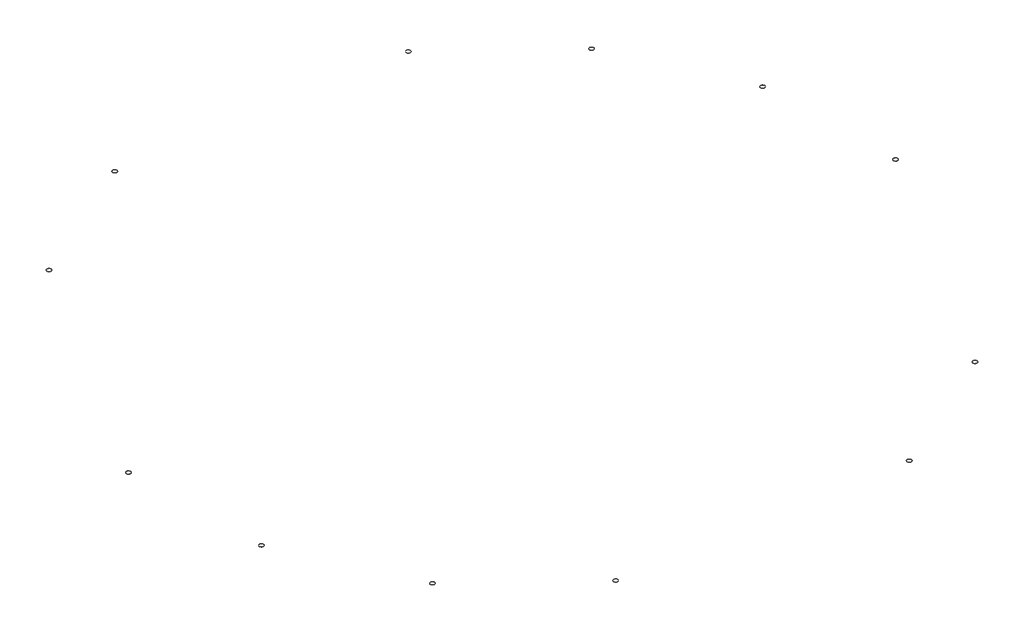
ISO-10303-21;
HEADER;
FILE_DESCRIPTION(('STEP AP214'),'2;1');
FILE_NAME('part.step','',(''),(''),'','','');
FILE_SCHEMA(('AUTOMOTIVE_DESIGN { 1 0 10303 214 1 1 1 1 }'));
ENDSEC;
DATA;
#1=APPLICATION_CONTEXT('core data for automotive mechanical design processes');
#2=APPLICATION_PROTOCOL_DEFINITION('international standard','automotive_design',2000,#1);
#3=PRODUCT_CONTEXT('',#1,'mechanical');
#4=PRODUCT('Part','Part','',(#3));
#5=PRODUCT_RELATED_PRODUCT_CATEGORY('part','',(#4));
#6=PRODUCT_DEFINITION_FORMATION('','',#4);
#7=PRODUCT_DEFINITION_CONTEXT('part definition',#1,'design');
#8=PRODUCT_DEFINITION('design','',#6,#7);
#9=PRODUCT_DEFINITION_SHAPE('','',#8);
#10=(LENGTH_UNIT() NAMED_UNIT(*) SI_UNIT(.MILLI.,.METRE.));
#11=(NAMED_UNIT(*) PLANE_ANGLE_UNIT() SI_UNIT($,.RADIAN.));
#12=(NAMED_UNIT(*) SI_UNIT($,.STERADIAN.) SOLID_ANGLE_UNIT());
#13=UNCERTAINTY_MEASURE_WITH_UNIT(LENGTH_MEASURE(1.E-05),#10,'distance_accuracy_value','');
#14=(GEOMETRIC_REPRESENTATION_CONTEXT(3) GLOBAL_UNCERTAINTY_ASSIGNED_CONTEXT((#13)) GLOBAL_UNIT_ASSIGNED_CONTEXT((#10,
#11,#12)) REPRESENTATION_CONTEXT('',''));
#15=CARTESIAN_POINT('',(0.,0.,0.));
#16=DIRECTION('',(0.,0.,1.));
#17=DIRECTION('',(1.,0.,0.));
#18=AXIS2_PLACEMENT_3D('',#15,#16,#17);
#19=CARTESIAN_POINT('',(-3286.66746070596,3.175,-2073.73273175129));
#20=DIRECTION('',(0.,1.,0.));
#21=DIRECTION('',(0.,0.,1.));
#22=AXIS2_PLACEMENT_3D('',#19,#20,#21);
#23=PLANE('',#22);
#24=CARTESIAN_POINT('',(-3286.66746070596,3.175,-2073.73273175129));
#25=DIRECTION('',(0.,1.,0.));
#26=DIRECTION('',(0.,0.,1.));
#27=AXIS2_PLACEMENT_3D('',#24,#25,#26);
#28=CIRCLE('',#27,25.3999999999998);
#29=CARTESIAN_POINT('',(-3286.66746070596,3.175,-2048.33273175129));
#30=VERTEX_POINT('',#29);
#31=EDGE_CURVE('E11',#30,#30,#28,.T.);
#32=ORIENTED_EDGE('',*,*,#31,.T.);
#33=EDGE_LOOP('',(#32));
#34=FACE_BOUND('',#33,.T.);
#35=CARTESIAN_POINT('',(-3286.66746070596,3.175,-2073.73273175129));
#36=DIRECTION('',(0.,1.,0.));
#37=DIRECTION('',(0.,0.,1.));
#38=AXIS2_PLACEMENT_3D('',#35,#36,#37);
#39=CIRCLE('',#38,22.2250000000001);
#40=CARTESIAN_POINT('',(-3286.66746070596,3.175,-2051.50773175129));
#41=VERTEX_POINT('',#40);
#42=EDGE_CURVE('E51',#41,#41,#39,.T.);
#43=ORIENTED_EDGE('',*,*,#42,.F.);
#44=EDGE_LOOP('',(#43));
#45=FACE_BOUND('',#44,.T.);
#46=ADVANCED_FACE('F40',(#34,#45),#23,.T.);
#47=CARTESIAN_POINT('',(-3286.66746070596,0.,-2073.73273175129));
#48=DIRECTION('',(0.,1.,0.));
#49=DIRECTION('',(0.,0.,1.));
#50=AXIS2_PLACEMENT_3D('',#47,#48,#49);
#51=PLANE('',#50);
#52=CARTESIAN_POINT('',(-3286.66746070596,0.,-2073.73273175129));
#53=DIRECTION('',(0.,1.,0.));
#54=DIRECTION('',(0.,0.,1.));
#55=AXIS2_PLACEMENT_3D('',#52,#53,#54);
#56=CIRCLE('',#55,25.3999999999998);
#57=CARTESIAN_POINT('',(-3286.66746070596,0.,-2048.33273175129));
#58=VERTEX_POINT('',#57);
#59=EDGE_CURVE('E44',#58,#58,#56,.T.);
#60=ORIENTED_EDGE('',*,*,#59,.F.);
#61=EDGE_LOOP('',(#60));
#62=FACE_BOUND('',#61,.T.);
#63=CARTESIAN_POINT('',(-3286.66746070596,0.,-2073.73273175129));
#64=DIRECTION('',(0.,1.,0.));
#65=DIRECTION('',(0.,0.,1.));
#66=AXIS2_PLACEMENT_3D('',#63,#64,#65);
#67=CIRCLE('',#66,22.2250000000001);
#68=CARTESIAN_POINT('',(-3286.66746070596,0.,-2051.50773175129));
#69=VERTEX_POINT('',#68);
#70=EDGE_CURVE('E53',#69,#69,#67,.T.);
#71=ORIENTED_EDGE('',*,*,#70,.T.);
#72=EDGE_LOOP('',(#71));
#73=FACE_BOUND('',#72,.T.);
#74=ADVANCED_FACE('F63',(#62,#73),#51,.F.);
#75=CARTESIAN_POINT('',(-3286.66746070596,3.175,-2073.73273175129));
#76=DIRECTION('',(0.,-1.,0.));
#77=DIRECTION('',(0.,0.,-1.));
#78=AXIS2_PLACEMENT_3D('',#75,#76,#77);
#79=CYLINDRICAL_SURFACE('',#78,25.3999999999998);
#80=ORIENTED_EDGE('',*,*,#31,.F.);
#81=EDGE_LOOP('',(#80));
#82=FACE_BOUND('',#81,.T.);
#83=ORIENTED_EDGE('',*,*,#59,.T.);
#84=EDGE_LOOP('',(#83));
#85=FACE_BOUND('',#84,.T.);
#86=ADVANCED_FACE('F42',(#82,#85),#79,.T.);
#87=CARTESIAN_POINT('',(-3286.66746070596,3.175,-2073.73273175129));
#88=DIRECTION('',(0.,-1.,0.));
#89=DIRECTION('',(0.,0.,-1.));
#90=AXIS2_PLACEMENT_3D('',#87,#88,#89);
#91=CYLINDRICAL_SURFACE('',#90,22.2250000000001);
#92=ORIENTED_EDGE('',*,*,#42,.T.);
#93=EDGE_LOOP('',(#92));
#94=FACE_BOUND('',#93,.T.);
#95=ORIENTED_EDGE('',*,*,#70,.F.);
#96=EDGE_LOOP('',(#95));
#97=FACE_BOUND('',#96,.T.);
#98=ADVANCED_FACE('F59',(#94,#97),#91,.F.);
#99=CLOSED_SHELL('',(#46,#74,#86,#98));
#100=MANIFOLD_SOLID_BREP('B2',#99);
#101=CARTESIAN_POINT('',(-2242.90163752268,3.175,-3173.63241166933));
#102=DIRECTION('',(0.,1.,0.));
#103=DIRECTION('',(0.,0.,1.));
#104=AXIS2_PLACEMENT_3D('',#101,#102,#103);
#105=PLANE('',#104);
#106=CARTESIAN_POINT('',(-2242.90163752268,3.175,-3173.63241166933));
#107=DIRECTION('',(0.,1.,0.));
#108=DIRECTION('',(0.,0.,1.));
#109=AXIS2_PLACEMENT_3D('',#106,#107,#108);
#110=CIRCLE('',#109,25.3999999999998);
#111=CARTESIAN_POINT('',(-2242.90163752268,3.175,-3148.23241166933));
#112=VERTEX_POINT('',#111);
#113=EDGE_CURVE('E39',#112,#112,#110,.T.);
#114=ORIENTED_EDGE('',*,*,#113,.T.);
#115=EDGE_LOOP('',(#114));
#116=FACE_BOUND('',#115,.T.);
#117=CARTESIAN_POINT('',(-2242.90163752268,3.175,-3173.63241166933));
#118=DIRECTION('',(0.,1.,0.));
#119=DIRECTION('',(0.,0.,1.));
#120=AXIS2_PLACEMENT_3D('',#117,#118,#119);
#121=CIRCLE('',#120,22.2250000000001);
#122=CARTESIAN_POINT('',(-2242.90163752268,3.175,-3151.40741166933));
#123=VERTEX_POINT('',#122);
#124=EDGE_CURVE('E121',#123,#123,#121,.T.);
#125=ORIENTED_EDGE('',*,*,#124,.F.);
#126=EDGE_LOOP('',(#125));
#127=FACE_BOUND('',#126,.T.);
#128=ADVANCED_FACE('F110',(#116,#127),#105,.T.);
#129=CARTESIAN_POINT('',(-2242.90163752268,0.,-3173.63241166933));
#130=DIRECTION('',(0.,1.,0.));
#131=DIRECTION('',(0.,0.,1.));
#132=AXIS2_PLACEMENT_3D('',#129,#130,#131);
#133=PLANE('',#132);
#134=CARTESIAN_POINT('',(-2242.90163752268,0.,-3173.63241166933));
#135=DIRECTION('',(0.,1.,0.));
#136=DIRECTION('',(0.,0.,1.));
#137=AXIS2_PLACEMENT_3D('',#134,#135,#136);
#138=CIRCLE('',#137,25.3999999999998);
#139=CARTESIAN_POINT('',(-2242.90163752268,0.,-3148.23241166933));
#140=VERTEX_POINT('',#139);
#141=EDGE_CURVE('E114',#140,#140,#138,.T.);
#142=ORIENTED_EDGE('',*,*,#141,.F.);
#143=EDGE_LOOP('',(#142));
#144=FACE_BOUND('',#143,.T.);
#145=CARTESIAN_POINT('',(-2242.90163752268,0.,-3173.63241166933));
#146=DIRECTION('',(0.,1.,0.));
#147=DIRECTION('',(0.,0.,1.));
#148=AXIS2_PLACEMENT_3D('',#145,#146,#147);
#149=CIRCLE('',#148,22.2250000000001);
#150=CARTESIAN_POINT('',(-2242.90163752268,0.,-3151.40741166933));
#151=VERTEX_POINT('',#150);
#152=EDGE_CURVE('E123',#151,#151,#149,.T.);
#153=ORIENTED_EDGE('',*,*,#152,.T.);
#154=EDGE_LOOP('',(#153));
#155=FACE_BOUND('',#154,.T.);
#156=ADVANCED_FACE('F133',(#144,#155),#133,.F.);
#157=CARTESIAN_POINT('',(-2242.90163752268,3.175,-3173.63241166933));
#158=DIRECTION('',(0.,-1.,0.));
#159=DIRECTION('',(0.,0.,-1.));
#160=AXIS2_PLACEMENT_3D('',#157,#158,#159);
#161=CYLINDRICAL_SURFACE('',#160,25.3999999999998);
#162=ORIENTED_EDGE('',*,*,#113,.F.);
#163=EDGE_LOOP('',(#162));
#164=FACE_BOUND('',#163,.T.);
#165=ORIENTED_EDGE('',*,*,#141,.T.);
#166=EDGE_LOOP('',(#165));
#167=FACE_BOUND('',#166,.T.);
#168=ADVANCED_FACE('F112',(#164,#167),#161,.T.);
#169=CARTESIAN_POINT('',(-2242.90163752268,3.175,-3173.63241166933));
#170=DIRECTION('',(0.,-1.,0.));
#171=DIRECTION('',(0.,0.,-1.));
#172=AXIS2_PLACEMENT_3D('',#169,#170,#171);
#173=CYLINDRICAL_SURFACE('',#172,22.2250000000001);
#174=ORIENTED_EDGE('',*,*,#124,.T.);
#175=EDGE_LOOP('',(#174));
#176=FACE_BOUND('',#175,.T.);
#177=ORIENTED_EDGE('',*,*,#152,.F.);
#178=EDGE_LOOP('',(#177));
#179=FACE_BOUND('',#178,.T.);
#180=ADVANCED_FACE('F129',(#176,#179),#173,.F.);
#181=CLOSED_SHELL('',(#128,#156,#168,#180));
#182=MANIFOLD_SOLID_BREP('B6',#181);
#183=CARTESIAN_POINT('',(-857.674371980562,3.175,-3790.37532596018));
#184=DIRECTION('',(0.,1.,0.));
#185=DIRECTION('',(0.,0.,1.));
#186=AXIS2_PLACEMENT_3D('',#183,#184,#185);
#187=PLANE('',#186);
#188=CARTESIAN_POINT('',(-857.674371980562,3.175,-3790.37532596018));
#189=DIRECTION('',(0.,1.,0.));
#190=DIRECTION('',(0.,0.,1.));
#191=AXIS2_PLACEMENT_3D('',#188,#189,#190);
#192=CIRCLE('',#191,25.4);
#193=CARTESIAN_POINT('',(-857.674371980562,3.175,-3764.97532596018));
#194=VERTEX_POINT('',#193);
#195=EDGE_CURVE('E109',#194,#194,#192,.T.);
#196=ORIENTED_EDGE('',*,*,#195,.T.);
#197=EDGE_LOOP('',(#196));
#198=FACE_BOUND('',#197,.T.);
#199=CARTESIAN_POINT('',(-857.674371980562,3.175,-3790.37532596018));
#200=DIRECTION('',(0.,1.,0.));
#201=DIRECTION('',(0.,0.,1.));
#202=AXIS2_PLACEMENT_3D('',#199,#200,#201);
#203=CIRCLE('',#202,22.225);
#204=CARTESIAN_POINT('',(-857.674371980562,3.175,-3768.15032596018));
#205=VERTEX_POINT('',#204);
#206=EDGE_CURVE('E191',#205,#205,#203,.T.);
#207=ORIENTED_EDGE('',*,*,#206,.F.);
#208=EDGE_LOOP('',(#207));
#209=FACE_BOUND('',#208,.T.);
#210=ADVANCED_FACE('F180',(#198,#209),#187,.T.);
#211=CARTESIAN_POINT('',(-857.674371980562,0.,-3790.37532596018));
#212=DIRECTION('',(0.,1.,0.));
#213=DIRECTION('',(0.,0.,1.));
#214=AXIS2_PLACEMENT_3D('',#211,#212,#213);
#215=PLANE('',#214);
#216=CARTESIAN_POINT('',(-857.674371980562,0.,-3790.37532596018));
#217=DIRECTION('',(0.,1.,0.));
#218=DIRECTION('',(0.,0.,1.));
#219=AXIS2_PLACEMENT_3D('',#216,#217,#218);
#220=CIRCLE('',#219,25.4);
#221=CARTESIAN_POINT('',(-857.674371980562,0.,-3764.97532596018));
#222=VERTEX_POINT('',#221);
#223=EDGE_CURVE('E184',#222,#222,#220,.T.);
#224=ORIENTED_EDGE('',*,*,#223,.F.);
#225=EDGE_LOOP('',(#224));
#226=FACE_BOUND('',#225,.T.);
#227=CARTESIAN_POINT('',(-857.674371980562,0.,-3790.37532596018));
#228=DIRECTION('',(0.,1.,0.));
#229=DIRECTION('',(0.,0.,1.));
#230=AXIS2_PLACEMENT_3D('',#227,#228,#229);
#231=CIRCLE('',#230,22.225);
#232=CARTESIAN_POINT('',(-857.674371980562,0.,-3768.15032596018));
#233=VERTEX_POINT('',#232);
#234=EDGE_CURVE('E193',#233,#233,#231,.T.);
#235=ORIENTED_EDGE('',*,*,#234,.T.);
#236=EDGE_LOOP('',(#235));
#237=FACE_BOUND('',#236,.T.);
#238=ADVANCED_FACE('F203',(#226,#237),#215,.F.);
#239=CARTESIAN_POINT('',(-857.674371980562,3.175,-3790.37532596018));
#240=DIRECTION('',(0.,-1.,0.));
#241=DIRECTION('',(0.,0.,-1.));
#242=AXIS2_PLACEMENT_3D('',#239,#240,#241);
#243=CYLINDRICAL_SURFACE('',#242,25.4);
#244=ORIENTED_EDGE('',*,*,#195,.F.);
#245=EDGE_LOOP('',(#244));
#246=FACE_BOUND('',#245,.T.);
#247=ORIENTED_EDGE('',*,*,#223,.T.);
#248=EDGE_LOOP('',(#247));
#249=FACE_BOUND('',#248,.T.);
#250=ADVANCED_FACE('F182',(#246,#249),#243,.T.);
#251=CARTESIAN_POINT('',(-857.674371980562,3.175,-3790.37532596018));
#252=DIRECTION('',(0.,-1.,0.));
#253=DIRECTION('',(0.,0.,-1.));
#254=AXIS2_PLACEMENT_3D('',#251,#252,#253);
#255=CYLINDRICAL_SURFACE('',#254,22.225);
#256=ORIENTED_EDGE('',*,*,#206,.T.);
#257=EDGE_LOOP('',(#256));
#258=FACE_BOUND('',#257,.T.);
#259=ORIENTED_EDGE('',*,*,#234,.F.);
#260=EDGE_LOOP('',(#259));
#261=FACE_BOUND('',#260,.T.);
#262=ADVANCED_FACE('F199',(#258,#261),#255,.F.);
#263=CLOSED_SHELL('',(#210,#238,#250,#262));
#264=MANIFOLD_SOLID_BREP('B34',#263);
#265=CARTESIAN_POINT('',(658.126041858051,3.175,-3830.06795671151));
#266=DIRECTION('',(0.,1.,0.));
#267=DIRECTION('',(0.,0.,1.));
#268=AXIS2_PLACEMENT_3D('',#265,#266,#267);
#269=PLANE('',#268);
#270=CARTESIAN_POINT('',(658.126041858051,3.175,-3830.06795671151));
#271=DIRECTION('',(0.,1.,0.));
#272=DIRECTION('',(0.,0.,1.));
#273=AXIS2_PLACEMENT_3D('',#270,#271,#272);
#274=CIRCLE('',#273,25.4);
#275=CARTESIAN_POINT('',(658.126041858051,3.175,-3804.66795671151));
#276=VERTEX_POINT('',#275);
#277=EDGE_CURVE('E179',#276,#276,#274,.T.);
#278=ORIENTED_EDGE('',*,*,#277,.T.);
#279=EDGE_LOOP('',(#278));
#280=FACE_BOUND('',#279,.T.);
#281=CARTESIAN_POINT('',(658.126041858051,3.175,-3830.06795671151));
#282=DIRECTION('',(0.,1.,0.));
#283=DIRECTION('',(0.,0.,1.));
#284=AXIS2_PLACEMENT_3D('',#281,#282,#283);
#285=CIRCLE('',#284,22.225);
#286=CARTESIAN_POINT('',(658.126041858051,3.175,-3807.84295671151));
#287=VERTEX_POINT('',#286);
#288=EDGE_CURVE('E261',#287,#287,#285,.T.);
#289=ORIENTED_EDGE('',*,*,#288,.F.);
#290=EDGE_LOOP('',(#289));
#291=FACE_BOUND('',#290,.T.);
#292=ADVANCED_FACE('F250',(#280,#291),#269,.T.);
#293=CARTESIAN_POINT('',(658.126041858051,0.,-3830.06795671151));
#294=DIRECTION('',(0.,1.,0.));
#295=DIRECTION('',(0.,0.,1.));
#296=AXIS2_PLACEMENT_3D('',#293,#294,#295);
#297=PLANE('',#296);
#298=CARTESIAN_POINT('',(658.126041858051,0.,-3830.06795671151));
#299=DIRECTION('',(0.,1.,0.));
#300=DIRECTION('',(0.,0.,1.));
#301=AXIS2_PLACEMENT_3D('',#298,#299,#300);
#302=CIRCLE('',#301,25.4);
#303=CARTESIAN_POINT('',(658.126041858051,0.,-3804.66795671151));
#304=VERTEX_POINT('',#303);
#305=EDGE_CURVE('E254',#304,#304,#302,.T.);
#306=ORIENTED_EDGE('',*,*,#305,.F.);
#307=EDGE_LOOP('',(#306));
#308=FACE_BOUND('',#307,.T.);
#309=CARTESIAN_POINT('',(658.126041858051,0.,-3830.06795671151));
#310=DIRECTION('',(0.,1.,0.));
#311=DIRECTION('',(0.,0.,1.));
#312=AXIS2_PLACEMENT_3D('',#309,#310,#311);
#313=CIRCLE('',#312,22.225);
#314=CARTESIAN_POINT('',(658.126041858051,0.,-3807.84295671151));
#315=VERTEX_POINT('',#314);
#316=EDGE_CURVE('E263',#315,#315,#313,.T.);
#317=ORIENTED_EDGE('',*,*,#316,.T.);
#318=EDGE_LOOP('',(#317));
#319=FACE_BOUND('',#318,.T.);
#320=ADVANCED_FACE('F273',(#308,#319),#297,.F.);
#321=CARTESIAN_POINT('',(658.126041858051,3.175,-3830.06795671151));
#322=DIRECTION('',(0.,-1.,0.));
#323=DIRECTION('',(0.,0.,-1.));
#324=AXIS2_PLACEMENT_3D('',#321,#322,#323);
#325=CYLINDRICAL_SURFACE('',#324,25.4);
#326=ORIENTED_EDGE('',*,*,#277,.F.);
#327=EDGE_LOOP('',(#326));
#328=FACE_BOUND('',#327,.T.);
#329=ORIENTED_EDGE('',*,*,#305,.T.);
#330=EDGE_LOOP('',(#329));
#331=FACE_BOUND('',#330,.T.);
#332=ADVANCED_FACE('F252',(#328,#331),#325,.T.);
#333=CARTESIAN_POINT('',(658.126041858051,3.175,-3830.06795671151));
#334=DIRECTION('',(0.,-1.,0.));
#335=DIRECTION('',(0.,0.,-1.));
#336=AXIS2_PLACEMENT_3D('',#333,#334,#335);
#337=CYLINDRICAL_SURFACE('',#336,22.225);
#338=ORIENTED_EDGE('',*,*,#288,.T.);
#339=EDGE_LOOP('',(#338));
#340=FACE_BOUND('',#339,.T.);
#341=ORIENTED_EDGE('',*,*,#316,.F.);
#342=EDGE_LOOP('',(#341));
#343=FACE_BOUND('',#342,.T.);
#344=ADVANCED_FACE('F269',(#340,#343),#337,.F.);
#345=CLOSED_SHELL('',(#292,#320,#332,#344));
#346=MANIFOLD_SOLID_BREP('B104',#345);
#347=CARTESIAN_POINT('',(3173.63241166929,3.175,-2242.90163752274));
#348=DIRECTION('',(0.,1.,0.));
#349=DIRECTION('',(0.,0.,1.));
#350=AXIS2_PLACEMENT_3D('',#347,#348,#349);
#351=PLANE('',#350);
#352=CARTESIAN_POINT('',(3173.63241166929,3.175,-2242.90163752274));
#353=DIRECTION('',(0.,1.,0.));
#354=DIRECTION('',(0.,0.,1.));
#355=AXIS2_PLACEMENT_3D('',#352,#353,#354);
#356=CIRCLE('',#355,25.3999999999998);
#357=CARTESIAN_POINT('',(3173.63241166929,3.175,-2217.50163752274));
#358=VERTEX_POINT('',#357);
#359=EDGE_CURVE('E249',#358,#358,#356,.T.);
#360=ORIENTED_EDGE('',*,*,#359,.T.);
#361=EDGE_LOOP('',(#360));
#362=FACE_BOUND('',#361,.T.);
#363=CARTESIAN_POINT('',(3173.63241166929,3.175,-2242.90163752274));
#364=DIRECTION('',(0.,1.,0.));
#365=DIRECTION('',(0.,0.,1.));
#366=AXIS2_PLACEMENT_3D('',#363,#364,#365);
#367=CIRCLE('',#366,22.2250000000001);
#368=CARTESIAN_POINT('',(3173.63241166929,3.175,-2220.67663752274));
#369=VERTEX_POINT('',#368);
#370=EDGE_CURVE('E331',#369,#369,#367,.T.);
#371=ORIENTED_EDGE('',*,*,#370,.F.);
#372=EDGE_LOOP('',(#371));
#373=FACE_BOUND('',#372,.T.);
#374=ADVANCED_FACE('F320',(#362,#373),#351,.T.);
#375=CARTESIAN_POINT('',(3173.63241166929,0.,-2242.90163752274));
#376=DIRECTION('',(0.,1.,0.));
#377=DIRECTION('',(0.,0.,1.));
#378=AXIS2_PLACEMENT_3D('',#375,#376,#377);
#379=PLANE('',#378);
#380=CARTESIAN_POINT('',(3173.63241166929,0.,-2242.90163752274));
#381=DIRECTION('',(0.,1.,0.));
#382=DIRECTION('',(0.,0.,1.));
#383=AXIS2_PLACEMENT_3D('',#380,#381,#382);
#384=CIRCLE('',#383,25.3999999999998);
#385=CARTESIAN_POINT('',(3173.63241166929,0.,-2217.50163752274));
#386=VERTEX_POINT('',#385);
#387=EDGE_CURVE('E324',#386,#386,#384,.T.);
#388=ORIENTED_EDGE('',*,*,#387,.F.);
#389=EDGE_LOOP('',(#388));
#390=FACE_BOUND('',#389,.T.);
#391=CARTESIAN_POINT('',(3173.63241166929,0.,-2242.90163752274));
#392=DIRECTION('',(0.,1.,0.));
#393=DIRECTION('',(0.,0.,1.));
#394=AXIS2_PLACEMENT_3D('',#391,#392,#393);
#395=CIRCLE('',#394,22.2250000000001);
#396=CARTESIAN_POINT('',(3173.63241166929,0.,-2220.67663752274));
#397=VERTEX_POINT('',#396);
#398=EDGE_CURVE('E333',#397,#397,#395,.T.);
#399=ORIENTED_EDGE('',*,*,#398,.T.);
#400=EDGE_LOOP('',(#399));
#401=FACE_BOUND('',#400,.T.);
#402=ADVANCED_FACE('F343',(#390,#401),#379,.F.);
#403=CARTESIAN_POINT('',(3173.63241166929,3.175,-2242.90163752274));
#404=DIRECTION('',(0.,-1.,0.));
#405=DIRECTION('',(0.,0.,-1.));
#406=AXIS2_PLACEMENT_3D('',#403,#404,#405);
#407=CYLINDRICAL_SURFACE('',#406,25.3999999999998);
#408=ORIENTED_EDGE('',*,*,#359,.F.);
#409=EDGE_LOOP('',(#408));
#410=FACE_BOUND('',#409,.T.);
#411=ORIENTED_EDGE('',*,*,#387,.T.);
#412=EDGE_LOOP('',(#411));
#413=FACE_BOUND('',#412,.T.);
#414=ADVANCED_FACE('F322',(#410,#413),#407,.T.);
#415=CARTESIAN_POINT('',(3173.63241166929,3.175,-2242.90163752274));
#416=DIRECTION('',(0.,-1.,0.));
#417=DIRECTION('',(0.,0.,-1.));
#418=AXIS2_PLACEMENT_3D('',#415,#416,#417);
#419=CYLINDRICAL_SURFACE('',#418,22.2250000000001);
#420=ORIENTED_EDGE('',*,*,#370,.T.);
#421=EDGE_LOOP('',(#420));
#422=FACE_BOUND('',#421,.T.);
#423=ORIENTED_EDGE('',*,*,#398,.F.);
#424=EDGE_LOOP('',(#423));
#425=FACE_BOUND('',#424,.T.);
#426=ADVANCED_FACE('F339',(#422,#425),#419,.F.);
#427=CLOSED_SHELL('',(#374,#402,#414,#426));
#428=MANIFOLD_SOLID_BREP('B174',#427);
#429=CARTESIAN_POINT('',(3790.37532596017,3.175,-857.674371980631));
#430=DIRECTION('',(0.,1.,0.));
#431=DIRECTION('',(0.,0.,1.));
#432=AXIS2_PLACEMENT_3D('',#429,#430,#431);
#433=PLANE('',#432);
#434=CARTESIAN_POINT('',(3790.37532596017,3.175,-857.674371980631));
#435=DIRECTION('',(0.,1.,0.));
#436=DIRECTION('',(0.,0.,1.));
#437=AXIS2_PLACEMENT_3D('',#434,#435,#436);
#438=CIRCLE('',#437,25.3999999999998);
#439=CARTESIAN_POINT('',(3790.37532596017,3.175,-832.274371980631));
#440=VERTEX_POINT('',#439);
#441=EDGE_CURVE('E319',#440,#440,#438,.T.);
#442=ORIENTED_EDGE('',*,*,#441,.T.);
#443=EDGE_LOOP('',(#442));
#444=FACE_BOUND('',#443,.T.);
#445=CARTESIAN_POINT('',(3790.37532596017,3.175,-857.674371980631));
#446=DIRECTION('',(0.,1.,0.));
#447=DIRECTION('',(0.,0.,1.));
#448=AXIS2_PLACEMENT_3D('',#445,#446,#447);
#449=CIRCLE('',#448,22.2250000000001);
#450=CARTESIAN_POINT('',(3790.37532596017,3.175,-835.449371980631));
#451=VERTEX_POINT('',#450);
#452=EDGE_CURVE('E401',#451,#451,#449,.T.);
#453=ORIENTED_EDGE('',*,*,#452,.F.);
#454=EDGE_LOOP('',(#453));
#455=FACE_BOUND('',#454,.T.);
#456=ADVANCED_FACE('F390',(#444,#455),#433,.T.);
#457=CARTESIAN_POINT('',(3790.37532596017,0.,-857.674371980631));
#458=DIRECTION('',(0.,1.,0.));
#459=DIRECTION('',(0.,0.,1.));
#460=AXIS2_PLACEMENT_3D('',#457,#458,#459);
#461=PLANE('',#460);
#462=CARTESIAN_POINT('',(3790.37532596017,0.,-857.674371980631));
#463=DIRECTION('',(0.,1.,0.));
#464=DIRECTION('',(0.,0.,1.));
#465=AXIS2_PLACEMENT_3D('',#462,#463,#464);
#466=CIRCLE('',#465,25.3999999999998);
#467=CARTESIAN_POINT('',(3790.37532596017,0.,-832.274371980631));
#468=VERTEX_POINT('',#467);
#469=EDGE_CURVE('E394',#468,#468,#466,.T.);
#470=ORIENTED_EDGE('',*,*,#469,.F.);
#471=EDGE_LOOP('',(#470));
#472=FACE_BOUND('',#471,.T.);
#473=CARTESIAN_POINT('',(3790.37532596017,0.,-857.674371980631));
#474=DIRECTION('',(0.,1.,0.));
#475=DIRECTION('',(0.,0.,1.));
#476=AXIS2_PLACEMENT_3D('',#473,#474,#475);
#477=CIRCLE('',#476,22.2250000000001);
#478=CARTESIAN_POINT('',(3790.37532596017,0.,-835.449371980631));
#479=VERTEX_POINT('',#478);
#480=EDGE_CURVE('E403',#479,#479,#477,.T.);
#481=ORIENTED_EDGE('',*,*,#480,.T.);
#482=EDGE_LOOP('',(#481));
#483=FACE_BOUND('',#482,.T.);
#484=ADVANCED_FACE('F413',(#472,#483),#461,.F.);
#485=CARTESIAN_POINT('',(3790.37532596017,3.175,-857.674371980631));
#486=DIRECTION('',(0.,-1.,0.));
#487=DIRECTION('',(0.,0.,-1.));
#488=AXIS2_PLACEMENT_3D('',#485,#486,#487);
#489=CYLINDRICAL_SURFACE('',#488,25.3999999999998);
#490=ORIENTED_EDGE('',*,*,#441,.F.);
#491=EDGE_LOOP('',(#490));
#492=FACE_BOUND('',#491,.T.);
#493=ORIENTED_EDGE('',*,*,#469,.T.);
#494=EDGE_LOOP('',(#493));
#495=FACE_BOUND('',#494,.T.);
#496=ADVANCED_FACE('F392',(#492,#495),#489,.T.);
#497=CARTESIAN_POINT('',(3790.37532596017,3.175,-857.674371980631));
#498=DIRECTION('',(0.,-1.,0.));
#499=DIRECTION('',(0.,0.,-1.));
#500=AXIS2_PLACEMENT_3D('',#497,#498,#499);
#501=CYLINDRICAL_SURFACE('',#500,22.2250000000001);
#502=ORIENTED_EDGE('',*,*,#452,.T.);
#503=EDGE_LOOP('',(#502));
#504=FACE_BOUND('',#503,.T.);
#505=ORIENTED_EDGE('',*,*,#480,.F.);
#506=EDGE_LOOP('',(#505));
#507=FACE_BOUND('',#506,.T.);
#508=ADVANCED_FACE('F409',(#504,#507),#501,.F.);
#509=CLOSED_SHELL('',(#456,#484,#496,#508));
#510=MANIFOLD_SOLID_BREP('B244',#509);
#511=CARTESIAN_POINT('',(3286.66746070594,3.175,2073.73273175131));
#512=DIRECTION('',(0.,1.,0.));
#513=DIRECTION('',(0.,0.,1.));
#514=AXIS2_PLACEMENT_3D('',#511,#512,#513);
#515=PLANE('',#514);
#516=CARTESIAN_POINT('',(3286.66746070594,3.175,2073.73273175131));
#517=DIRECTION('',(0.,1.,0.));
#518=DIRECTION('',(0.,0.,1.));
#519=AXIS2_PLACEMENT_3D('',#516,#517,#518);
#520=CIRCLE('',#519,25.3999999999998);
#521=CARTESIAN_POINT('',(3286.66746070594,3.175,2099.13273175131));
#522=VERTEX_POINT('',#521);
#523=EDGE_CURVE('E389',#522,#522,#520,.T.);
#524=ORIENTED_EDGE('',*,*,#523,.T.);
#525=EDGE_LOOP('',(#524));
#526=FACE_BOUND('',#525,.T.);
#527=CARTESIAN_POINT('',(3286.66746070594,3.175,2073.73273175131));
#528=DIRECTION('',(0.,1.,0.));
#529=DIRECTION('',(0.,0.,1.));
#530=AXIS2_PLACEMENT_3D('',#527,#528,#529);
#531=CIRCLE('',#530,22.2250000000001);
#532=CARTESIAN_POINT('',(3286.66746070594,3.175,2095.95773175131));
#533=VERTEX_POINT('',#532);
#534=EDGE_CURVE('E471',#533,#533,#531,.T.);
#535=ORIENTED_EDGE('',*,*,#534,.F.);
#536=EDGE_LOOP('',(#535));
#537=FACE_BOUND('',#536,.T.);
#538=ADVANCED_FACE('F460',(#526,#537),#515,.T.);
#539=CARTESIAN_POINT('',(3286.66746070594,0.,2073.73273175131));
#540=DIRECTION('',(0.,1.,0.));
#541=DIRECTION('',(0.,0.,1.));
#542=AXIS2_PLACEMENT_3D('',#539,#540,#541);
#543=PLANE('',#542);
#544=CARTESIAN_POINT('',(3286.66746070594,0.,2073.73273175131));
#545=DIRECTION('',(0.,1.,0.));
#546=DIRECTION('',(0.,0.,1.));
#547=AXIS2_PLACEMENT_3D('',#544,#545,#546);
#548=CIRCLE('',#547,25.3999999999998);
#549=CARTESIAN_POINT('',(3286.66746070594,0.,2099.13273175131));
#550=VERTEX_POINT('',#549);
#551=EDGE_CURVE('E464',#550,#550,#548,.T.);
#552=ORIENTED_EDGE('',*,*,#551,.F.);
#553=EDGE_LOOP('',(#552));
#554=FACE_BOUND('',#553,.T.);
#555=CARTESIAN_POINT('',(3286.66746070594,0.,2073.73273175131));
#556=DIRECTION('',(0.,1.,0.));
#557=DIRECTION('',(0.,0.,1.));
#558=AXIS2_PLACEMENT_3D('',#555,#556,#557);
#559=CIRCLE('',#558,22.2250000000001);
#560=CARTESIAN_POINT('',(3286.66746070594,0.,2095.95773175131));
#561=VERTEX_POINT('',#560);
#562=EDGE_CURVE('E473',#561,#561,#559,.T.);
#563=ORIENTED_EDGE('',*,*,#562,.T.);
#564=EDGE_LOOP('',(#563));
#565=FACE_BOUND('',#564,.T.);
#566=ADVANCED_FACE('F483',(#554,#565),#543,.F.);
#567=CARTESIAN_POINT('',(3286.66746070594,3.175,2073.73273175131));
#568=DIRECTION('',(0.,-1.,0.));
#569=DIRECTION('',(0.,0.,-1.));
#570=AXIS2_PLACEMENT_3D('',#567,#568,#569);
#571=CYLINDRICAL_SURFACE('',#570,25.3999999999998);
#572=ORIENTED_EDGE('',*,*,#523,.F.);
#573=EDGE_LOOP('',(#572));
#574=FACE_BOUND('',#573,.T.);
#575=ORIENTED_EDGE('',*,*,#551,.T.);
#576=EDGE_LOOP('',(#575));
#577=FACE_BOUND('',#576,.T.);
#578=ADVANCED_FACE('F462',(#574,#577),#571,.T.);
#579=CARTESIAN_POINT('',(3286.66746070594,3.175,2073.73273175131));
#580=DIRECTION('',(0.,-1.,0.));
#581=DIRECTION('',(0.,0.,-1.));
#582=AXIS2_PLACEMENT_3D('',#579,#580,#581);
#583=CYLINDRICAL_SURFACE('',#582,22.2250000000001);
#584=ORIENTED_EDGE('',*,*,#534,.T.);
#585=EDGE_LOOP('',(#584));
#586=FACE_BOUND('',#585,.T.);
#587=ORIENTED_EDGE('',*,*,#562,.F.);
#588=EDGE_LOOP('',(#587));
#589=FACE_BOUND('',#588,.T.);
#590=ADVANCED_FACE('F479',(#586,#589),#583,.F.);
#591=CLOSED_SHELL('',(#538,#566,#578,#590));
#592=MANIFOLD_SOLID_BREP('B314',#591);
#593=CARTESIAN_POINT('',(2242.90163752266,3.175,3173.63241166934));
#594=DIRECTION('',(0.,1.,0.));
#595=DIRECTION('',(0.,0.,1.));
#596=AXIS2_PLACEMENT_3D('',#593,#594,#595);
#597=PLANE('',#596);
#598=CARTESIAN_POINT('',(2242.90163752266,3.175,3173.63241166934));
#599=DIRECTION('',(0.,1.,0.));
#600=DIRECTION('',(0.,0.,1.));
#601=AXIS2_PLACEMENT_3D('',#598,#599,#600);
#602=CIRCLE('',#601,25.3999999999998);
#603=CARTESIAN_POINT('',(2242.90163752266,3.175,3199.03241166934));
#604=VERTEX_POINT('',#603);
#605=EDGE_CURVE('E459',#604,#604,#602,.T.);
#606=ORIENTED_EDGE('',*,*,#605,.T.);
#607=EDGE_LOOP('',(#606));
#608=FACE_BOUND('',#607,.T.);
#609=CARTESIAN_POINT('',(2242.90163752266,3.175,3173.63241166934));
#610=DIRECTION('',(0.,1.,0.));
#611=DIRECTION('',(0.,0.,1.));
#612=AXIS2_PLACEMENT_3D('',#609,#610,#611);
#613=CIRCLE('',#612,22.2250000000001);
#614=CARTESIAN_POINT('',(2242.90163752266,3.175,3195.85741166934));
#615=VERTEX_POINT('',#614);
#616=EDGE_CURVE('E541',#615,#615,#613,.T.);
#617=ORIENTED_EDGE('',*,*,#616,.F.);
#618=EDGE_LOOP('',(#617));
#619=FACE_BOUND('',#618,.T.);
#620=ADVANCED_FACE('F530',(#608,#619),#597,.T.);
#621=CARTESIAN_POINT('',(2242.90163752266,0.,3173.63241166934));
#622=DIRECTION('',(0.,1.,0.));
#623=DIRECTION('',(0.,0.,1.));
#624=AXIS2_PLACEMENT_3D('',#621,#622,#623);
#625=PLANE('',#624);
#626=CARTESIAN_POINT('',(2242.90163752266,0.,3173.63241166934));
#627=DIRECTION('',(0.,1.,0.));
#628=DIRECTION('',(0.,0.,1.));
#629=AXIS2_PLACEMENT_3D('',#626,#627,#628);
#630=CIRCLE('',#629,25.3999999999998);
#631=CARTESIAN_POINT('',(2242.90163752266,0.,3199.03241166934));
#632=VERTEX_POINT('',#631);
#633=EDGE_CURVE('E534',#632,#632,#630,.T.);
#634=ORIENTED_EDGE('',*,*,#633,.F.);
#635=EDGE_LOOP('',(#634));
#636=FACE_BOUND('',#635,.T.);
#637=CARTESIAN_POINT('',(2242.90163752266,0.,3173.63241166934));
#638=DIRECTION('',(0.,1.,0.));
#639=DIRECTION('',(0.,0.,1.));
#640=AXIS2_PLACEMENT_3D('',#637,#638,#639);
#641=CIRCLE('',#640,22.2250000000001);
#642=CARTESIAN_POINT('',(2242.90163752266,0.,3195.85741166934));
#643=VERTEX_POINT('',#642);
#644=EDGE_CURVE('E543',#643,#643,#641,.T.);
#645=ORIENTED_EDGE('',*,*,#644,.T.);
#646=EDGE_LOOP('',(#645));
#647=FACE_BOUND('',#646,.T.);
#648=ADVANCED_FACE('F553',(#636,#647),#625,.F.);
#649=CARTESIAN_POINT('',(2242.90163752266,3.175,3173.63241166934));
#650=DIRECTION('',(0.,-1.,0.));
#651=DIRECTION('',(0.,0.,-1.));
#652=AXIS2_PLACEMENT_3D('',#649,#650,#651);
#653=CYLINDRICAL_SURFACE('',#652,25.3999999999998);
#654=ORIENTED_EDGE('',*,*,#605,.F.);
#655=EDGE_LOOP('',(#654));
#656=FACE_BOUND('',#655,.T.);
#657=ORIENTED_EDGE('',*,*,#633,.T.);
#658=EDGE_LOOP('',(#657));
#659=FACE_BOUND('',#658,.T.);
#660=ADVANCED_FACE('F532',(#656,#659),#653,.T.);
#661=CARTESIAN_POINT('',(2242.90163752266,3.175,3173.63241166934));
#662=DIRECTION('',(0.,-1.,0.));
#663=DIRECTION('',(0.,0.,-1.));
#664=AXIS2_PLACEMENT_3D('',#661,#662,#663);
#665=CYLINDRICAL_SURFACE('',#664,22.2250000000001);
#666=ORIENTED_EDGE('',*,*,#616,.T.);
#667=EDGE_LOOP('',(#666));
#668=FACE_BOUND('',#667,.T.);
#669=ORIENTED_EDGE('',*,*,#644,.F.);
#670=EDGE_LOOP('',(#669));
#671=FACE_BOUND('',#670,.T.);
#672=ADVANCED_FACE('F549',(#668,#671),#665,.F.);
#673=CLOSED_SHELL('',(#620,#648,#660,#672));
#674=MANIFOLD_SOLID_BREP('B384',#673);
#675=CARTESIAN_POINT('',(857.674371980533,3.175,3790.37532596019));
#676=DIRECTION('',(0.,1.,0.));
#677=DIRECTION('',(0.,0.,1.));
#678=AXIS2_PLACEMENT_3D('',#675,#676,#677);
#679=PLANE('',#678);
#680=CARTESIAN_POINT('',(857.674371980533,3.175,3790.37532596019));
#681=DIRECTION('',(0.,1.,0.));
#682=DIRECTION('',(0.,0.,1.));
#683=AXIS2_PLACEMENT_3D('',#680,#681,#682);
#684=CIRCLE('',#683,25.4);
#685=CARTESIAN_POINT('',(857.674371980533,3.175,3815.77532596019));
#686=VERTEX_POINT('',#685);
#687=EDGE_CURVE('E529',#686,#686,#684,.T.);
#688=ORIENTED_EDGE('',*,*,#687,.T.);
#689=EDGE_LOOP('',(#688));
#690=FACE_BOUND('',#689,.T.);
#691=CARTESIAN_POINT('',(857.674371980533,3.175,3790.37532596019));
#692=DIRECTION('',(0.,1.,0.));
#693=DIRECTION('',(0.,0.,1.));
#694=AXIS2_PLACEMENT_3D('',#691,#692,#693);
#695=CIRCLE('',#694,22.225);
#696=CARTESIAN_POINT('',(857.674371980533,3.175,3812.60032596019));
#697=VERTEX_POINT('',#696);
#698=EDGE_CURVE('E611',#697,#697,#695,.T.);
#699=ORIENTED_EDGE('',*,*,#698,.F.);
#700=EDGE_LOOP('',(#699));
#701=FACE_BOUND('',#700,.T.);
#702=ADVANCED_FACE('F600',(#690,#701),#679,.T.);
#703=CARTESIAN_POINT('',(857.674371980533,0.,3790.37532596019));
#704=DIRECTION('',(0.,1.,0.));
#705=DIRECTION('',(0.,0.,1.));
#706=AXIS2_PLACEMENT_3D('',#703,#704,#705);
#707=PLANE('',#706);
#708=CARTESIAN_POINT('',(857.674371980533,0.,3790.37532596019));
#709=DIRECTION('',(0.,1.,0.));
#710=DIRECTION('',(0.,0.,1.));
#711=AXIS2_PLACEMENT_3D('',#708,#709,#710);
#712=CIRCLE('',#711,25.4);
#713=CARTESIAN_POINT('',(857.674371980533,0.,3815.77532596019));
#714=VERTEX_POINT('',#713);
#715=EDGE_CURVE('E604',#714,#714,#712,.T.);
#716=ORIENTED_EDGE('',*,*,#715,.F.);
#717=EDGE_LOOP('',(#716));
#718=FACE_BOUND('',#717,.T.);
#719=CARTESIAN_POINT('',(857.674371980533,0.,3790.37532596019));
#720=DIRECTION('',(0.,1.,0.));
#721=DIRECTION('',(0.,0.,1.));
#722=AXIS2_PLACEMENT_3D('',#719,#720,#721);
#723=CIRCLE('',#722,22.225);
#724=CARTESIAN_POINT('',(857.674371980533,0.,3812.60032596019));
#725=VERTEX_POINT('',#724);
#726=EDGE_CURVE('E613',#725,#725,#723,.T.);
#727=ORIENTED_EDGE('',*,*,#726,.T.);
#728=EDGE_LOOP('',(#727));
#729=FACE_BOUND('',#728,.T.);
#730=ADVANCED_FACE('F623',(#718,#729),#707,.F.);
#731=CARTESIAN_POINT('',(857.674371980533,3.175,3790.37532596019));
#732=DIRECTION('',(0.,-1.,0.));
#733=DIRECTION('',(0.,0.,-1.));
#734=AXIS2_PLACEMENT_3D('',#731,#732,#733);
#735=CYLINDRICAL_SURFACE('',#734,25.4);
#736=ORIENTED_EDGE('',*,*,#687,.F.);
#737=EDGE_LOOP('',(#736));
#738=FACE_BOUND('',#737,.T.);
#739=ORIENTED_EDGE('',*,*,#715,.T.);
#740=EDGE_LOOP('',(#739));
#741=FACE_BOUND('',#740,.T.);
#742=ADVANCED_FACE('F602',(#738,#741),#735,.T.);
#743=CARTESIAN_POINT('',(857.674371980533,3.175,3790.37532596019));
#744=DIRECTION('',(0.,-1.,0.));
#745=DIRECTION('',(0.,0.,-1.));
#746=AXIS2_PLACEMENT_3D('',#743,#744,#745);
#747=CYLINDRICAL_SURFACE('',#746,22.225);
#748=ORIENTED_EDGE('',*,*,#698,.T.);
#749=EDGE_LOOP('',(#748));
#750=FACE_BOUND('',#749,.T.);
#751=ORIENTED_EDGE('',*,*,#726,.F.);
#752=EDGE_LOOP('',(#751));
#753=FACE_BOUND('',#752,.T.);
#754=ADVANCED_FACE('F619',(#750,#753),#747,.F.);
#755=CLOSED_SHELL('',(#702,#730,#742,#754));
#756=MANIFOLD_SOLID_BREP('B454',#755);
#757=CARTESIAN_POINT('',(-658.12604185808,3.175,3830.0679567115));
#758=DIRECTION('',(0.,1.,0.));
#759=DIRECTION('',(0.,0.,1.));
#760=AXIS2_PLACEMENT_3D('',#757,#758,#759);
#761=PLANE('',#760);
#762=CARTESIAN_POINT('',(-658.12604185808,3.175,3830.0679567115));
#763=DIRECTION('',(0.,1.,0.));
#764=DIRECTION('',(0.,0.,1.));
#765=AXIS2_PLACEMENT_3D('',#762,#763,#764);
#766=CIRCLE('',#765,25.4);
#767=CARTESIAN_POINT('',(-658.12604185808,3.175,3855.4679567115));
#768=VERTEX_POINT('',#767);
#769=EDGE_CURVE('E599',#768,#768,#766,.T.);
#770=ORIENTED_EDGE('',*,*,#769,.T.);
#771=EDGE_LOOP('',(#770));
#772=FACE_BOUND('',#771,.T.);
#773=CARTESIAN_POINT('',(-658.12604185808,3.175,3830.0679567115));
#774=DIRECTION('',(0.,1.,0.));
#775=DIRECTION('',(0.,0.,1.));
#776=AXIS2_PLACEMENT_3D('',#773,#774,#775);
#777=CIRCLE('',#776,22.225);
#778=CARTESIAN_POINT('',(-658.12604185808,3.175,3852.2929567115));
#779=VERTEX_POINT('',#778);
#780=EDGE_CURVE('E681',#779,#779,#777,.T.);
#781=ORIENTED_EDGE('',*,*,#780,.F.);
#782=EDGE_LOOP('',(#781));
#783=FACE_BOUND('',#782,.T.);
#784=ADVANCED_FACE('F670',(#772,#783),#761,.T.);
#785=CARTESIAN_POINT('',(-658.12604185808,0.,3830.0679567115));
#786=DIRECTION('',(0.,1.,0.));
#787=DIRECTION('',(0.,0.,1.));
#788=AXIS2_PLACEMENT_3D('',#785,#786,#787);
#789=PLANE('',#788);
#790=CARTESIAN_POINT('',(-658.12604185808,0.,3830.0679567115));
#791=DIRECTION('',(0.,1.,0.));
#792=DIRECTION('',(0.,0.,1.));
#793=AXIS2_PLACEMENT_3D('',#790,#791,#792);
#794=CIRCLE('',#793,25.4);
#795=CARTESIAN_POINT('',(-658.12604185808,0.,3855.4679567115));
#796=VERTEX_POINT('',#795);
#797=EDGE_CURVE('E674',#796,#796,#794,.T.);
#798=ORIENTED_EDGE('',*,*,#797,.F.);
#799=EDGE_LOOP('',(#798));
#800=FACE_BOUND('',#799,.T.);
#801=CARTESIAN_POINT('',(-658.12604185808,0.,3830.0679567115));
#802=DIRECTION('',(0.,1.,0.));
#803=DIRECTION('',(0.,0.,1.));
#804=AXIS2_PLACEMENT_3D('',#801,#802,#803);
#805=CIRCLE('',#804,22.225);
#806=CARTESIAN_POINT('',(-658.12604185808,0.,3852.2929567115));
#807=VERTEX_POINT('',#806);
#808=EDGE_CURVE('E683',#807,#807,#805,.T.);
#809=ORIENTED_EDGE('',*,*,#808,.T.);
#810=EDGE_LOOP('',(#809));
#811=FACE_BOUND('',#810,.T.);
#812=ADVANCED_FACE('F693',(#800,#811),#789,.F.);
#813=CARTESIAN_POINT('',(-658.12604185808,3.175,3830.0679567115));
#814=DIRECTION('',(0.,-1.,0.));
#815=DIRECTION('',(0.,0.,-1.));
#816=AXIS2_PLACEMENT_3D('',#813,#814,#815);
#817=CYLINDRICAL_SURFACE('',#816,25.4);
#818=ORIENTED_EDGE('',*,*,#769,.F.);
#819=EDGE_LOOP('',(#818));
#820=FACE_BOUND('',#819,.T.);
#821=ORIENTED_EDGE('',*,*,#797,.T.);
#822=EDGE_LOOP('',(#821));
#823=FACE_BOUND('',#822,.T.);
#824=ADVANCED_FACE('F672',(#820,#823),#817,.T.);
#825=CARTESIAN_POINT('',(-658.12604185808,3.175,3830.0679567115));
#826=DIRECTION('',(0.,-1.,0.));
#827=DIRECTION('',(0.,0.,-1.));
#828=AXIS2_PLACEMENT_3D('',#825,#826,#827);
#829=CYLINDRICAL_SURFACE('',#828,22.225);
#830=ORIENTED_EDGE('',*,*,#780,.T.);
#831=EDGE_LOOP('',(#830));
#832=FACE_BOUND('',#831,.T.);
#833=ORIENTED_EDGE('',*,*,#808,.F.);
#834=EDGE_LOOP('',(#833));
#835=FACE_BOUND('',#834,.T.);
#836=ADVANCED_FACE('F689',(#832,#835),#829,.F.);
#837=CLOSED_SHELL('',(#784,#812,#824,#836));
#838=MANIFOLD_SOLID_BREP('B524',#837);
#839=CARTESIAN_POINT('',(-3173.63241166934,3.175,2242.90163752267));
#840=DIRECTION('',(0.,1.,0.));
#841=DIRECTION('',(0.,0.,1.));
#842=AXIS2_PLACEMENT_3D('',#839,#840,#841);
#843=PLANE('',#842);
#844=CARTESIAN_POINT('',(-3173.63241166934,3.175,2242.90163752267));
#845=DIRECTION('',(0.,1.,0.));
#846=DIRECTION('',(0.,0.,1.));
#847=AXIS2_PLACEMENT_3D('',#844,#845,#846);
#848=CIRCLE('',#847,25.3999999999998);
#849=CARTESIAN_POINT('',(-3173.63241166934,3.175,2268.30163752267));
#850=VERTEX_POINT('',#849);
#851=EDGE_CURVE('E669',#850,#850,#848,.T.);
#852=ORIENTED_EDGE('',*,*,#851,.T.);
#853=EDGE_LOOP('',(#852));
#854=FACE_BOUND('',#853,.T.);
#855=CARTESIAN_POINT('',(-3173.63241166934,3.175,2242.90163752267));
#856=DIRECTION('',(0.,1.,0.));
#857=DIRECTION('',(0.,0.,1.));
#858=AXIS2_PLACEMENT_3D('',#855,#856,#857);
#859=CIRCLE('',#858,22.2250000000001);
#860=CARTESIAN_POINT('',(-3173.63241166934,3.175,2265.12663752267));
#861=VERTEX_POINT('',#860);
#862=EDGE_CURVE('E750',#861,#861,#859,.T.);
#863=ORIENTED_EDGE('',*,*,#862,.F.);
#864=EDGE_LOOP('',(#863));
#865=FACE_BOUND('',#864,.T.);
#866=ADVANCED_FACE('F739',(#854,#865),#843,.T.);
#867=CARTESIAN_POINT('',(-3173.63241166934,0.,2242.90163752267));
#868=DIRECTION('',(0.,1.,0.));
#869=DIRECTION('',(0.,0.,1.));
#870=AXIS2_PLACEMENT_3D('',#867,#868,#869);
#871=PLANE('',#870);
#872=CARTESIAN_POINT('',(-3173.63241166934,0.,2242.90163752267));
#873=DIRECTION('',(0.,1.,0.));
#874=DIRECTION('',(0.,0.,1.));
#875=AXIS2_PLACEMENT_3D('',#872,#873,#874);
#876=CIRCLE('',#875,25.3999999999998);
#877=CARTESIAN_POINT('',(-3173.63241166934,0.,2268.30163752267));
#878=VERTEX_POINT('',#877);
#879=EDGE_CURVE('E743',#878,#878,#876,.T.);
#880=ORIENTED_EDGE('',*,*,#879,.F.);
#881=EDGE_LOOP('',(#880));
#882=FACE_BOUND('',#881,.T.);
#883=CARTESIAN_POINT('',(-3173.63241166934,0.,2242.90163752267));
#884=DIRECTION('',(0.,1.,0.));
#885=DIRECTION('',(0.,0.,1.));
#886=AXIS2_PLACEMENT_3D('',#883,#884,#885);
#887=CIRCLE('',#886,22.2250000000001);
#888=CARTESIAN_POINT('',(-3173.63241166934,0.,2265.12663752267));
#889=VERTEX_POINT('',#888);
#890=EDGE_CURVE('E752',#889,#889,#887,.T.);
#891=ORIENTED_EDGE('',*,*,#890,.T.);
#892=EDGE_LOOP('',(#891));
#893=FACE_BOUND('',#892,.T.);
#894=ADVANCED_FACE('F762',(#882,#893),#871,.F.);
#895=CARTESIAN_POINT('',(-3173.63241166934,3.175,2242.90163752267));
#896=DIRECTION('',(0.,-1.,0.));
#897=DIRECTION('',(0.,0.,-1.));
#898=AXIS2_PLACEMENT_3D('',#895,#896,#897);
#899=CYLINDRICAL_SURFACE('',#898,25.3999999999998);
#900=ORIENTED_EDGE('',*,*,#851,.F.);
#901=EDGE_LOOP('',(#900));
#902=FACE_BOUND('',#901,.T.);
#903=ORIENTED_EDGE('',*,*,#879,.T.);
#904=EDGE_LOOP('',(#903));
#905=FACE_BOUND('',#904,.T.);
#906=ADVANCED_FACE('F741',(#902,#905),#899,.T.);
#907=CARTESIAN_POINT('',(-3173.63241166934,3.175,2242.90163752267));
#908=DIRECTION('',(0.,-1.,0.));
#909=DIRECTION('',(0.,0.,-1.));
#910=AXIS2_PLACEMENT_3D('',#907,#908,#909);
#911=CYLINDRICAL_SURFACE('',#910,22.2250000000001);
#912=ORIENTED_EDGE('',*,*,#862,.T.);
#913=EDGE_LOOP('',(#912));
#914=FACE_BOUND('',#913,.T.);
#915=ORIENTED_EDGE('',*,*,#890,.F.);
#916=EDGE_LOOP('',(#915));
#917=FACE_BOUND('',#916,.T.);
#918=ADVANCED_FACE('F758',(#914,#917),#911,.F.);
#919=CLOSED_SHELL('',(#866,#894,#906,#918));
#920=MANIFOLD_SOLID_BREP('B594',#919);
#921=CARTESIAN_POINT('',(-3790.37532596019,3.175,857.674371980521));
#922=DIRECTION('',(0.,1.,0.));
#923=DIRECTION('',(0.,0.,1.));
#924=AXIS2_PLACEMENT_3D('',#921,#922,#923);
#925=PLANE('',#924);
#926=CARTESIAN_POINT('',(-3790.37532596019,3.175,857.674371980521));
#927=DIRECTION('',(0.,1.,0.));
#928=DIRECTION('',(0.,0.,1.));
#929=AXIS2_PLACEMENT_3D('',#926,#927,#928);
#930=CIRCLE('',#929,25.3999999999998);
#931=CARTESIAN_POINT('',(-3790.37532596019,3.175,883.07437198052));
#932=VERTEX_POINT('',#931);
#933=EDGE_CURVE('E738',#932,#932,#930,.T.);
#934=ORIENTED_EDGE('',*,*,#933,.T.);
#935=EDGE_LOOP('',(#934));
#936=FACE_BOUND('',#935,.T.);
#937=CARTESIAN_POINT('',(-3790.37532596019,3.175,857.674371980521));
#938=DIRECTION('',(0.,1.,0.));
#939=DIRECTION('',(0.,0.,1.));
#940=AXIS2_PLACEMENT_3D('',#937,#938,#939);
#941=CIRCLE('',#940,22.2250000000001);
#942=CARTESIAN_POINT('',(-3790.37532596019,3.175,879.899371980521));
#943=VERTEX_POINT('',#942);
#944=EDGE_CURVE('E812',#943,#943,#941,.T.);
#945=ORIENTED_EDGE('',*,*,#944,.F.);
#946=EDGE_LOOP('',(#945));
#947=FACE_BOUND('',#946,.T.);
#948=ADVANCED_FACE('F801',(#936,#947),#925,.T.);
#949=CARTESIAN_POINT('',(-3790.37532596019,0.,857.674371980521));
#950=DIRECTION('',(0.,1.,0.));
#951=DIRECTION('',(0.,0.,1.));
#952=AXIS2_PLACEMENT_3D('',#949,#950,#951);
#953=PLANE('',#952);
#954=CARTESIAN_POINT('',(-3790.37532596019,0.,857.674371980521));
#955=DIRECTION('',(0.,1.,0.));
#956=DIRECTION('',(0.,0.,1.));
#957=AXIS2_PLACEMENT_3D('',#954,#955,#956);
#958=CIRCLE('',#957,25.3999999999998);
#959=CARTESIAN_POINT('',(-3790.37532596019,0.,883.07437198052));
#960=VERTEX_POINT('',#959);
#961=EDGE_CURVE('E805',#960,#960,#958,.T.);
#962=ORIENTED_EDGE('',*,*,#961,.F.);
#963=EDGE_LOOP('',(#962));
#964=FACE_BOUND('',#963,.T.);
#965=CARTESIAN_POINT('',(-3790.37532596019,0.,857.674371980521));
#966=DIRECTION('',(0.,1.,0.));
#967=DIRECTION('',(0.,0.,1.));
#968=AXIS2_PLACEMENT_3D('',#965,#966,#967);
#969=CIRCLE('',#968,22.2250000000001);
#970=CARTESIAN_POINT('',(-3790.37532596019,0.,879.899371980521));
#971=VERTEX_POINT('',#970);
#972=EDGE_CURVE('E814',#971,#971,#969,.T.);
#973=ORIENTED_EDGE('',*,*,#972,.T.);
#974=EDGE_LOOP('',(#973));
#975=FACE_BOUND('',#974,.T.);
#976=ADVANCED_FACE('F824',(#964,#975),#953,.F.);
#977=CARTESIAN_POINT('',(-3790.37532596019,3.175,857.674371980521));
#978=DIRECTION('',(0.,-1.,0.));
#979=DIRECTION('',(0.,0.,-1.));
#980=AXIS2_PLACEMENT_3D('',#977,#978,#979);
#981=CYLINDRICAL_SURFACE('',#980,25.3999999999998);
#982=ORIENTED_EDGE('',*,*,#933,.F.);
#983=EDGE_LOOP('',(#982));
#984=FACE_BOUND('',#983,.T.);
#985=ORIENTED_EDGE('',*,*,#961,.T.);
#986=EDGE_LOOP('',(#985));
#987=FACE_BOUND('',#986,.T.);
#988=ADVANCED_FACE('F803',(#984,#987),#981,.T.);
#989=CARTESIAN_POINT('',(-3790.37532596019,3.175,857.674371980521));
#990=DIRECTION('',(0.,-1.,0.));
#991=DIRECTION('',(0.,0.,-1.));
#992=AXIS2_PLACEMENT_3D('',#989,#990,#991);
#993=CYLINDRICAL_SURFACE('',#992,22.2250000000001);
#994=ORIENTED_EDGE('',*,*,#944,.T.);
#995=EDGE_LOOP('',(#994));
#996=FACE_BOUND('',#995,.T.);
#997=ORIENTED_EDGE('',*,*,#972,.F.);
#998=EDGE_LOOP('',(#997));
#999=FACE_BOUND('',#998,.T.);
#1000=ADVANCED_FACE('F820',(#996,#999),#993,.F.);
#1001=CLOSED_SHELL('',(#948,#976,#988,#1000));
#1002=MANIFOLD_SOLID_BREP('B664',#1001);
#1003=ADVANCED_BREP_SHAPE_REPRESENTATION('',(#18,#100,#182,#264,#346,#428,#510,#592,#674,#756,
#838,#920,#1002),#14);
#1004=SHAPE_DEFINITION_REPRESENTATION(#9,#1003);
ENDSEC;
END-ISO-10303-21;
